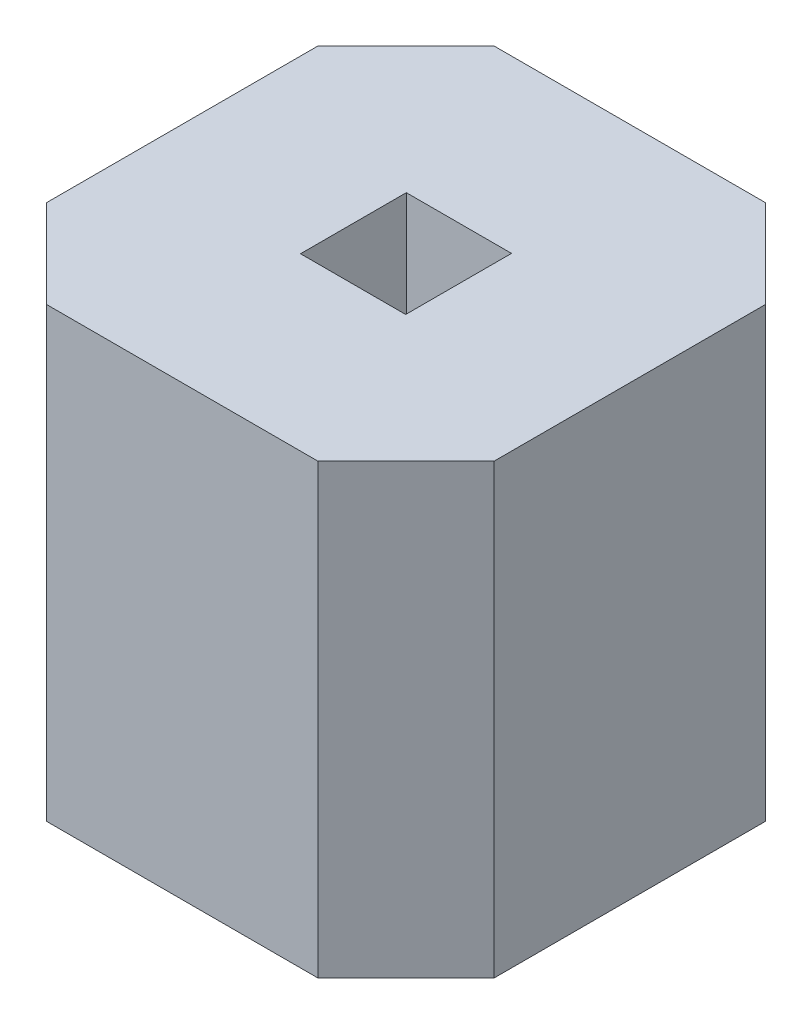
ISO-10303-21;
HEADER;
FILE_DESCRIPTION(('STEP AP214'),'2;1');
FILE_NAME('part.step','',(''),(''),'','','');
FILE_SCHEMA(('AUTOMOTIVE_DESIGN { 1 0 10303 214 1 1 1 1 }'));
ENDSEC;
DATA;
#1=APPLICATION_CONTEXT('core data for automotive mechanical design processes');
#2=APPLICATION_PROTOCOL_DEFINITION('international standard','automotive_design',2000,#1);
#3=PRODUCT_CONTEXT('',#1,'mechanical');
#4=PRODUCT('Part','Part','',(#3));
#5=PRODUCT_RELATED_PRODUCT_CATEGORY('part','',(#4));
#6=PRODUCT_DEFINITION_FORMATION('','',#4);
#7=PRODUCT_DEFINITION_CONTEXT('part definition',#1,'design');
#8=PRODUCT_DEFINITION('design','',#6,#7);
#9=PRODUCT_DEFINITION_SHAPE('','',#8);
#10=(LENGTH_UNIT() NAMED_UNIT(*) SI_UNIT(.MILLI.,.METRE.));
#11=(NAMED_UNIT(*) PLANE_ANGLE_UNIT() SI_UNIT($,.RADIAN.));
#12=(NAMED_UNIT(*) SI_UNIT($,.STERADIAN.) SOLID_ANGLE_UNIT());
#13=UNCERTAINTY_MEASURE_WITH_UNIT(LENGTH_MEASURE(1.E-05),#10,'distance_accuracy_value','');
#14=(GEOMETRIC_REPRESENTATION_CONTEXT(3) GLOBAL_UNCERTAINTY_ASSIGNED_CONTEXT((#13)) GLOBAL_UNIT_ASSIGNED_CONTEXT((#10,
#11,#12)) REPRESENTATION_CONTEXT('',''));
#15=CARTESIAN_POINT('',(0.,0.,0.));
#16=DIRECTION('',(0.,0.,1.));
#17=DIRECTION('',(1.,0.,0.));
#18=AXIS2_PLACEMENT_3D('',#15,#16,#17);
#19=CARTESIAN_POINT('',(-21.98157191173,2.54,-24.37699962006));
#20=DIRECTION('',(1.,0.,0.));
#21=DIRECTION('',(0.,0.,-1.));
#22=AXIS2_PLACEMENT_3D('',#19,#20,#21);
#23=PLANE('',#22);
#24=DIRECTION('',(0.,1.,0.));
#25=VECTOR('',#24,1.);
#26=CARTESIAN_POINT('',(-21.98157191173,2.54,-23.87699962006));
#27=LINE('',#26,#25);
#28=CARTESIAN_POINT('',(-21.98157191173,2.54,-23.87699962006));
#29=VERTEX_POINT('',#28);
#30=CARTESIAN_POINT('',(-21.98157191173,0.,-23.87699962006));
#31=VERTEX_POINT('',#30);
#32=EDGE_CURVE('E123',#29,#31,#27,.F.);
#33=ORIENTED_EDGE('',*,*,#32,.T.);
#34=DIRECTION('',(0.,0.,-1.));
#35=VECTOR('',#34,1.);
#36=CARTESIAN_POINT('',(-21.98157191173,0.,-24.37699962006));
#37=LINE('',#36,#35);
#38=CARTESIAN_POINT('',(-21.98157191173,0.,-22.33699962006));
#39=VERTEX_POINT('',#38);
#40=EDGE_CURVE('E20',#39,#31,#37,.T.);
#41=ORIENTED_EDGE('',*,*,#40,.F.);
#42=DIRECTION('',(0.,1.,0.));
#43=VECTOR('',#42,1.);
#44=CARTESIAN_POINT('',(-21.98157191173,2.54,-22.33699962006));
#45=LINE('',#44,#43);
#46=CARTESIAN_POINT('',(-21.98157191173,2.54,-22.33699962006));
#47=VERTEX_POINT('',#46);
#48=EDGE_CURVE('E118',#39,#47,#45,.T.);
#49=ORIENTED_EDGE('',*,*,#48,.T.);
#50=DIRECTION('',(0.,0.,-1.));
#51=VECTOR('',#50,1.);
#52=CARTESIAN_POINT('',(-21.98157191173,2.54,-24.37699962006));
#53=LINE('',#52,#51);
#54=EDGE_CURVE('E102',#29,#47,#53,.F.);
#55=ORIENTED_EDGE('',*,*,#54,.F.);
#56=EDGE_LOOP('',(#33,#41,#49,#55));
#57=FACE_BOUND('',#56,.T.);
#58=ADVANCED_FACE('F17',(#57),#23,.F.);
#59=CARTESIAN_POINT('',(-21.48157191173,2.54,-21.83699962006));
#60=DIRECTION('',(0.707106781186548,0.,-0.707106781186548));
#61=DIRECTION('',(-0.707106781186548,0.,-0.707106781186548));
#62=AXIS2_PLACEMENT_3D('',#59,#60,#61);
#63=PLANE('',#62);
#64=ORIENTED_EDGE('',*,*,#48,.F.);
#65=DIRECTION('',(-0.707106781186548,0.,-0.707106781186548));
#66=VECTOR('',#65,1.);
#67=CARTESIAN_POINT('',(-21.48157191173,0.,-21.83699962006));
#68=LINE('',#67,#66);
#69=CARTESIAN_POINT('',(-21.48157191173,0.,-21.83699962006));
#70=VERTEX_POINT('',#69);
#71=EDGE_CURVE('E107',#70,#39,#68,.T.);
#72=ORIENTED_EDGE('',*,*,#71,.F.);
#73=DIRECTION('',(0.,1.,0.));
#74=VECTOR('',#73,1.);
#75=CARTESIAN_POINT('',(-21.48157191173,2.54,-21.83699962006));
#76=LINE('',#75,#74);
#77=CARTESIAN_POINT('',(-21.48157191173,2.54,-21.83699962006));
#78=VERTEX_POINT('',#77);
#79=EDGE_CURVE('E140',#70,#78,#76,.T.);
#80=ORIENTED_EDGE('',*,*,#79,.T.);
#81=DIRECTION('',(-0.707106781186548,0.,-0.707106781186548));
#82=VECTOR('',#81,1.);
#83=CARTESIAN_POINT('',(-21.48157191173,2.54,-21.83699962006));
#84=LINE('',#83,#82);
#85=EDGE_CURVE('E126',#47,#78,#84,.F.);
#86=ORIENTED_EDGE('',*,*,#85,.F.);
#87=EDGE_LOOP('',(#64,#72,#80,#86));
#88=FACE_BOUND('',#87,.T.);
#89=ADVANCED_FACE('F125',(#88),#63,.F.);
#90=CARTESIAN_POINT('',(-21.98157191173,2.54,-23.87699962006));
#91=DIRECTION('',(0.707106781186548,0.,0.707106781186548));
#92=DIRECTION('',(0.707106781186548,0.,-0.707106781186548));
#93=AXIS2_PLACEMENT_3D('',#90,#91,#92);
#94=PLANE('',#93);
#95=DIRECTION('',(0.,1.,0.));
#96=VECTOR('',#95,1.);
#97=CARTESIAN_POINT('',(-21.48157191173,2.54,-24.37699962006));
#98=LINE('',#97,#96);
#99=CARTESIAN_POINT('',(-21.48157191173,2.54,-24.37699962006));
#100=VERTEX_POINT('',#99);
#101=CARTESIAN_POINT('',(-21.48157191173,0.,-24.37699962006));
#102=VERTEX_POINT('',#101);
#103=EDGE_CURVE('E146',#100,#102,#98,.F.);
#104=ORIENTED_EDGE('',*,*,#103,.T.);
#105=DIRECTION('',(0.707106781186548,0.,-0.707106781186548));
#106=VECTOR('',#105,1.);
#107=CARTESIAN_POINT('',(-21.98157191173,0.,-23.87699962006));
#108=LINE('',#107,#106);
#109=EDGE_CURVE('E131',#31,#102,#108,.T.);
#110=ORIENTED_EDGE('',*,*,#109,.F.);
#111=ORIENTED_EDGE('',*,*,#32,.F.);
#112=DIRECTION('',(0.707106781186548,0.,-0.707106781186548));
#113=VECTOR('',#112,1.);
#114=CARTESIAN_POINT('',(-21.98157191173,2.54,-23.87699962006));
#115=LINE('',#114,#113);
#116=EDGE_CURVE('E133',#100,#29,#115,.F.);
#117=ORIENTED_EDGE('',*,*,#116,.F.);
#118=EDGE_LOOP('',(#104,#110,#111,#117));
#119=FACE_BOUND('',#118,.T.);
#120=ADVANCED_FACE('F247',(#119),#94,.F.);
#121=CARTESIAN_POINT('',(-21.00996429062,-1.46,-22.8067653129));
#122=DIRECTION('',(0.,0.,1.));
#123=DIRECTION('',(1.,0.,0.));
#124=AXIS2_PLACEMENT_3D('',#121,#122,#123);
#125=PLANE('',#124);
#126=DIRECTION('',(1.,0.,0.));
#127=VECTOR('',#126,1.);
#128=CARTESIAN_POINT('',(-21.00996429062,2.54,-22.8067653129));
#129=LINE('',#128,#127);
#130=CARTESIAN_POINT('',(-20.41317953284,2.54,-22.8067653129));
#131=VERTEX_POINT('',#130);
#132=CARTESIAN_POINT('',(-21.00996429062,2.54,-22.8067653129));
#133=VERTEX_POINT('',#132);
#134=EDGE_CURVE('E137',#131,#133,#129,.F.);
#135=ORIENTED_EDGE('',*,*,#134,.F.);
#136=DIRECTION('',(0.,1.,0.));
#137=VECTOR('',#136,1.);
#138=CARTESIAN_POINT('',(-20.41317953284,-1.46,-22.8067653129));
#139=LINE('',#138,#137);
#140=CARTESIAN_POINT('',(-20.41317953284,0.,-22.8067653129));
#141=VERTEX_POINT('',#140);
#142=EDGE_CURVE('E158',#131,#141,#139,.F.);
#143=ORIENTED_EDGE('',*,*,#142,.T.);
#144=DIRECTION('',(1.,0.,0.));
#145=VECTOR('',#144,1.);
#146=CARTESIAN_POINT('',(-21.00996429062,0.,-22.8067653129));
#147=LINE('',#146,#145);
#148=CARTESIAN_POINT('',(-21.00996429062,0.,-22.8067653129));
#149=VERTEX_POINT('',#148);
#150=EDGE_CURVE('E135',#149,#141,#147,.T.);
#151=ORIENTED_EDGE('',*,*,#150,.F.);
#152=DIRECTION('',(0.,1.,0.));
#153=VECTOR('',#152,1.);
#154=CARTESIAN_POINT('',(-21.00996429062,-1.46,-22.8067653129));
#155=LINE('',#154,#153);
#156=EDGE_CURVE('E151',#149,#133,#155,.T.);
#157=ORIENTED_EDGE('',*,*,#156,.T.);
#158=EDGE_LOOP('',(#135,#143,#151,#157));
#159=FACE_BOUND('',#158,.T.);
#160=ADVANCED_FACE('F212',(#159),#125,.F.);
#161=CARTESIAN_POINT('',(-21.98157191173,2.54,-21.83699962006));
#162=DIRECTION('',(0.,0.,-1.));
#163=DIRECTION('',(-1.,0.,0.));
#164=AXIS2_PLACEMENT_3D('',#161,#162,#163);
#165=PLANE('',#164);
#166=ORIENTED_EDGE('',*,*,#79,.F.);
#167=DIRECTION('',(-1.,0.,0.));
#168=VECTOR('',#167,1.);
#169=CARTESIAN_POINT('',(-21.98157191173,0.,-21.83699962006));
#170=LINE('',#169,#168);
#171=CARTESIAN_POINT('',(-19.94157191173,0.,-21.83699962006));
#172=VERTEX_POINT('',#171);
#173=EDGE_CURVE('E113',#172,#70,#170,.T.);
#174=ORIENTED_EDGE('',*,*,#173,.F.);
#175=DIRECTION('',(0.,1.,0.));
#176=VECTOR('',#175,1.);
#177=CARTESIAN_POINT('',(-19.94157191173,2.54,-21.83699962006));
#178=LINE('',#177,#176);
#179=CARTESIAN_POINT('',(-19.94157191173,2.54,-21.83699962006));
#180=VERTEX_POINT('',#179);
#181=EDGE_CURVE('E161',#172,#180,#178,.T.);
#182=ORIENTED_EDGE('',*,*,#181,.T.);
#183=DIRECTION('',(-1.,0.,0.));
#184=VECTOR('',#183,1.);
#185=CARTESIAN_POINT('',(-21.98157191173,2.54,-21.83699962006));
#186=LINE('',#185,#184);
#187=EDGE_CURVE('E142',#78,#180,#186,.F.);
#188=ORIENTED_EDGE('',*,*,#187,.F.);
#189=EDGE_LOOP('',(#166,#174,#182,#188));
#190=FACE_BOUND('',#189,.T.);
#191=ADVANCED_FACE('F254',(#190),#165,.F.);
#192=CARTESIAN_POINT('',(-21.98157191173,2.54,-24.37699962006));
#193=DIRECTION('',(0.,0.,1.));
#194=DIRECTION('',(1.,0.,0.));
#195=AXIS2_PLACEMENT_3D('',#192,#193,#194);
#196=PLANE('',#195);
#197=ORIENTED_EDGE('',*,*,#103,.F.);
#198=DIRECTION('',(1.,0.,0.));
#199=VECTOR('',#198,1.);
#200=CARTESIAN_POINT('',(-21.98157191173,2.54,-24.37699962006));
#201=LINE('',#200,#199);
#202=CARTESIAN_POINT('',(-19.94157191173,2.54,-24.37699962006));
#203=VERTEX_POINT('',#202);
#204=EDGE_CURVE('E144',#203,#100,#201,.F.);
#205=ORIENTED_EDGE('',*,*,#204,.F.);
#206=DIRECTION('',(0.,1.,0.));
#207=VECTOR('',#206,1.);
#208=CARTESIAN_POINT('',(-19.94157191173,2.54,-24.37699962006));
#209=LINE('',#208,#207);
#210=CARTESIAN_POINT('',(-19.94157191173,0.,-24.37699962006));
#211=VERTEX_POINT('',#210);
#212=EDGE_CURVE('E166',#203,#211,#209,.F.);
#213=ORIENTED_EDGE('',*,*,#212,.T.);
#214=DIRECTION('',(1.,0.,0.));
#215=VECTOR('',#214,1.);
#216=CARTESIAN_POINT('',(-21.98157191173,0.,-24.37699962006));
#217=LINE('',#216,#215);
#218=EDGE_CURVE('E149',#102,#211,#217,.T.);
#219=ORIENTED_EDGE('',*,*,#218,.F.);
#220=EDGE_LOOP('',(#197,#205,#213,#219));
#221=FACE_BOUND('',#220,.T.);
#222=ADVANCED_FACE('F244',(#221),#196,.F.);
#223=CARTESIAN_POINT('',(-21.00996429062,-1.46,-23.40723392722));
#224=DIRECTION('',(-1.,0.,0.));
#225=DIRECTION('',(0.,0.,1.));
#226=AXIS2_PLACEMENT_3D('',#223,#224,#225);
#227=PLANE('',#226);
#228=DIRECTION('',(0.,0.,1.));
#229=VECTOR('',#228,1.);
#230=CARTESIAN_POINT('',(-21.00996429062,2.54,-23.40723392722));
#231=LINE('',#230,#229);
#232=CARTESIAN_POINT('',(-21.00996429062,2.54,-23.40723392722));
#233=VERTEX_POINT('',#232);
#234=EDGE_CURVE('E154',#133,#233,#231,.F.);
#235=ORIENTED_EDGE('',*,*,#234,.F.);
#236=ORIENTED_EDGE('',*,*,#156,.F.);
#237=DIRECTION('',(0.,0.,1.));
#238=VECTOR('',#237,1.);
#239=CARTESIAN_POINT('',(-21.00996429062,0.,0.));
#240=LINE('',#239,#238);
#241=CARTESIAN_POINT('',(-21.00996429062,0.,-23.40723392722));
#242=VERTEX_POINT('',#241);
#243=EDGE_CURVE('E170',#149,#242,#240,.F.);
#244=ORIENTED_EDGE('',*,*,#243,.T.);
#245=DIRECTION('',(0.,1.,0.));
#246=VECTOR('',#245,1.);
#247=CARTESIAN_POINT('',(-21.00996429062,-1.46,-23.40723392722));
#248=LINE('',#247,#246);
#249=EDGE_CURVE('E183',#242,#233,#248,.T.);
#250=ORIENTED_EDGE('',*,*,#249,.T.);
#251=EDGE_LOOP('',(#235,#236,#244,#250));
#252=FACE_BOUND('',#251,.T.);
#253=ADVANCED_FACE('F216',(#252),#227,.F.);
#254=CARTESIAN_POINT('',(-20.41317953284,-1.46,-23.40723392722));
#255=DIRECTION('',(1.,0.,0.));
#256=DIRECTION('',(0.,0.,-1.));
#257=AXIS2_PLACEMENT_3D('',#254,#255,#256);
#258=PLANE('',#257);
#259=DIRECTION('',(0.,0.,-1.));
#260=VECTOR('',#259,1.);
#261=CARTESIAN_POINT('',(-20.41317953284,2.54,-23.40723392722));
#262=LINE('',#261,#260);
#263=CARTESIAN_POINT('',(-20.41317953284,2.54,-23.40723392722));
#264=VERTEX_POINT('',#263);
#265=EDGE_CURVE('E156',#264,#131,#262,.F.);
#266=ORIENTED_EDGE('',*,*,#265,.F.);
#267=DIRECTION('',(0.,1.,0.));
#268=VECTOR('',#267,1.);
#269=CARTESIAN_POINT('',(-20.41317953284,-1.46,-23.40723392722));
#270=LINE('',#269,#268);
#271=CARTESIAN_POINT('',(-20.41317953284,0.,-23.40723392722));
#272=VERTEX_POINT('',#271);
#273=EDGE_CURVE('E186',#264,#272,#270,.F.);
#274=ORIENTED_EDGE('',*,*,#273,.T.);
#275=DIRECTION('',(0.,0.,1.));
#276=VECTOR('',#275,1.);
#277=CARTESIAN_POINT('',(-20.41317953284,0.,0.));
#278=LINE('',#277,#276);
#279=EDGE_CURVE('E172',#272,#141,#278,.T.);
#280=ORIENTED_EDGE('',*,*,#279,.T.);
#281=ORIENTED_EDGE('',*,*,#142,.F.);
#282=EDGE_LOOP('',(#266,#274,#280,#281));
#283=FACE_BOUND('',#282,.T.);
#284=ADVANCED_FACE('F209',(#283),#258,.F.);
#285=CARTESIAN_POINT('',(-19.44157191173,2.54,-22.33699962006));
#286=DIRECTION('',(-0.707106781186548,0.,-0.707106781186548));
#287=DIRECTION('',(-0.707106781186548,0.,0.707106781186548));
#288=AXIS2_PLACEMENT_3D('',#285,#286,#287);
#289=PLANE('',#288);
#290=ORIENTED_EDGE('',*,*,#181,.F.);
#291=DIRECTION('',(0.707106781186547,0.,-0.707106781186547));
#292=VECTOR('',#291,1.);
#293=CARTESIAN_POINT('',(-19.94157191173,0.,-21.83699962006));
#294=LINE('',#293,#292);
#295=CARTESIAN_POINT('',(-19.44157191173,0.,-22.33699962006));
#296=VERTEX_POINT('',#295);
#297=EDGE_CURVE('E175',#172,#296,#294,.T.);
#298=ORIENTED_EDGE('',*,*,#297,.T.);
#299=DIRECTION('',(0.,1.,0.));
#300=VECTOR('',#299,1.);
#301=CARTESIAN_POINT('',(-19.44157191173,2.54,-22.33699962006));
#302=LINE('',#301,#300);
#303=CARTESIAN_POINT('',(-19.44157191173,2.54,-22.33699962006));
#304=VERTEX_POINT('',#303);
#305=EDGE_CURVE('E189',#296,#304,#302,.T.);
#306=ORIENTED_EDGE('',*,*,#305,.T.);
#307=DIRECTION('',(-0.707106781186548,0.,0.707106781186548));
#308=VECTOR('',#307,1.);
#309=CARTESIAN_POINT('',(-19.44157191173,2.54,-22.33699962006));
#310=LINE('',#309,#308);
#311=EDGE_CURVE('E164',#180,#304,#310,.F.);
#312=ORIENTED_EDGE('',*,*,#311,.F.);
#313=EDGE_LOOP('',(#290,#298,#306,#312));
#314=FACE_BOUND('',#313,.T.);
#315=ADVANCED_FACE('F227',(#314),#289,.F.);
#316=CARTESIAN_POINT('',(-19.94157191173,2.54,-24.37699962006));
#317=DIRECTION('',(-0.707106781186548,0.,0.707106781186548));
#318=DIRECTION('',(0.707106781186548,0.,0.707106781186548));
#319=AXIS2_PLACEMENT_3D('',#316,#317,#318);
#320=PLANE('',#319);
#321=DIRECTION('',(0.,1.,0.));
#322=VECTOR('',#321,1.);
#323=CARTESIAN_POINT('',(-19.44157191173,2.54,-23.87699962006));
#324=LINE('',#323,#322);
#325=CARTESIAN_POINT('',(-19.44157191173,2.54,-23.87699962006));
#326=VERTEX_POINT('',#325);
#327=CARTESIAN_POINT('',(-19.44157191173,0.,-23.87699962006));
#328=VERTEX_POINT('',#327);
#329=EDGE_CURVE('E192',#326,#328,#324,.F.);
#330=ORIENTED_EDGE('',*,*,#329,.T.);
#331=DIRECTION('',(-0.707106781186547,0.,-0.707106781186547));
#332=VECTOR('',#331,1.);
#333=CARTESIAN_POINT('',(-19.44157191173,0.,-23.87699962006));
#334=LINE('',#333,#332);
#335=EDGE_CURVE('E177',#328,#211,#334,.T.);
#336=ORIENTED_EDGE('',*,*,#335,.T.);
#337=ORIENTED_EDGE('',*,*,#212,.F.);
#338=DIRECTION('',(0.707106781186548,0.,0.707106781186548));
#339=VECTOR('',#338,1.);
#340=CARTESIAN_POINT('',(-19.94157191173,2.54,-24.37699962006));
#341=LINE('',#340,#339);
#342=EDGE_CURVE('E35',#326,#203,#341,.F.);
#343=ORIENTED_EDGE('',*,*,#342,.F.);
#344=EDGE_LOOP('',(#330,#336,#337,#343));
#345=FACE_BOUND('',#344,.T.);
#346=ADVANCED_FACE('F218',(#345),#320,.F.);
#347=CARTESIAN_POINT('',(0.,0.,0.));
#348=DIRECTION('',(0.,1.,0.));
#349=DIRECTION('',(0.,0.,1.));
#350=AXIS2_PLACEMENT_3D('',#347,#348,#349);
#351=PLANE('',#350);
#352=ORIENTED_EDGE('',*,*,#109,.T.);
#353=ORIENTED_EDGE('',*,*,#218,.T.);
#354=ORIENTED_EDGE('',*,*,#335,.F.);
#355=DIRECTION('',(0.,0.,1.));
#356=VECTOR('',#355,1.);
#357=CARTESIAN_POINT('',(-19.44157191173,0.,-24.37699962006));
#358=LINE('',#357,#356);
#359=EDGE_CURVE('E194',#328,#296,#358,.T.);
#360=ORIENTED_EDGE('',*,*,#359,.T.);
#361=ORIENTED_EDGE('',*,*,#297,.F.);
#362=ORIENTED_EDGE('',*,*,#173,.T.);
#363=ORIENTED_EDGE('',*,*,#71,.T.);
#364=ORIENTED_EDGE('',*,*,#40,.T.);
#365=EDGE_LOOP('',(#352,#353,#354,#360,#361,#362,#363,#364));
#366=FACE_BOUND('',#365,.T.);
#367=ORIENTED_EDGE('',*,*,#279,.F.);
#368=DIRECTION('',(-1.,0.,0.));
#369=VECTOR('',#368,1.);
#370=CARTESIAN_POINT('',(-21.00996429062,0.,-23.40723392722));
#371=LINE('',#370,#369);
#372=EDGE_CURVE('E180',#272,#242,#371,.T.);
#373=ORIENTED_EDGE('',*,*,#372,.T.);
#374=ORIENTED_EDGE('',*,*,#243,.F.);
#375=ORIENTED_EDGE('',*,*,#150,.T.);
#376=EDGE_LOOP('',(#367,#373,#374,#375));
#377=FACE_BOUND('',#376,.T.);
#378=ADVANCED_FACE('F109',(#366,#377),#351,.F.);
#379=CARTESIAN_POINT('',(-21.00996429062,-1.46,-23.40723392722));
#380=DIRECTION('',(0.,0.,-1.));
#381=DIRECTION('',(-1.,0.,0.));
#382=AXIS2_PLACEMENT_3D('',#379,#380,#381);
#383=PLANE('',#382);
#384=DIRECTION('',(1.,0.,0.));
#385=VECTOR('',#384,1.);
#386=CARTESIAN_POINT('',(0.,2.54,-23.40723392722));
#387=LINE('',#386,#385);
#388=EDGE_CURVE('E26',#233,#264,#387,.T.);
#389=ORIENTED_EDGE('',*,*,#388,.F.);
#390=ORIENTED_EDGE('',*,*,#249,.F.);
#391=ORIENTED_EDGE('',*,*,#372,.F.);
#392=ORIENTED_EDGE('',*,*,#273,.F.);
#393=EDGE_LOOP('',(#389,#390,#391,#392));
#394=FACE_BOUND('',#393,.T.);
#395=ADVANCED_FACE('F206',(#394),#383,.F.);
#396=CARTESIAN_POINT('',(-19.44157191173,2.54,-24.37699962006));
#397=DIRECTION('',(-1.,0.,0.));
#398=DIRECTION('',(0.,0.,1.));
#399=AXIS2_PLACEMENT_3D('',#396,#397,#398);
#400=PLANE('',#399);
#401=ORIENTED_EDGE('',*,*,#329,.F.);
#402=DIRECTION('',(0.,0.,1.));
#403=VECTOR('',#402,1.);
#404=CARTESIAN_POINT('',(-19.44157191173,2.54,0.));
#405=LINE('',#404,#403);
#406=EDGE_CURVE('E11',#304,#326,#405,.F.);
#407=ORIENTED_EDGE('',*,*,#406,.F.);
#408=ORIENTED_EDGE('',*,*,#305,.F.);
#409=ORIENTED_EDGE('',*,*,#359,.F.);
#410=EDGE_LOOP('',(#401,#407,#408,#409));
#411=FACE_BOUND('',#410,.T.);
#412=ADVANCED_FACE('F225',(#411),#400,.F.);
#413=CARTESIAN_POINT('',(0.,2.54,0.));
#414=DIRECTION('',(0.,1.,0.));
#415=DIRECTION('',(0.,0.,1.));
#416=AXIS2_PLACEMENT_3D('',#413,#414,#415);
#417=PLANE('',#416);
#418=ORIENTED_EDGE('',*,*,#406,.T.);
#419=ORIENTED_EDGE('',*,*,#342,.T.);
#420=ORIENTED_EDGE('',*,*,#204,.T.);
#421=ORIENTED_EDGE('',*,*,#116,.T.);
#422=ORIENTED_EDGE('',*,*,#54,.T.);
#423=ORIENTED_EDGE('',*,*,#85,.T.);
#424=ORIENTED_EDGE('',*,*,#187,.T.);
#425=ORIENTED_EDGE('',*,*,#311,.T.);
#426=EDGE_LOOP('',(#418,#419,#420,#421,#422,#423,#424,#425));
#427=FACE_BOUND('',#426,.T.);
#428=ORIENTED_EDGE('',*,*,#234,.T.);
#429=ORIENTED_EDGE('',*,*,#388,.T.);
#430=ORIENTED_EDGE('',*,*,#265,.T.);
#431=ORIENTED_EDGE('',*,*,#134,.T.);
#432=EDGE_LOOP('',(#428,#429,#430,#431));
#433=FACE_BOUND('',#432,.T.);
#434=ADVANCED_FACE('F200',(#427,#433),#417,.T.);
#435=CLOSED_SHELL('',(#58,#89,#120,#160,#191,#222,#253,#284,#315,#346,#378,#395,#412,#434));
#436=MANIFOLD_SOLID_BREP('B1',#435);
#437=ADVANCED_BREP_SHAPE_REPRESENTATION('',(#18,#436),#14);
#438=SHAPE_DEFINITION_REPRESENTATION(#9,#437);
ENDSEC;
END-ISO-10303-21;
